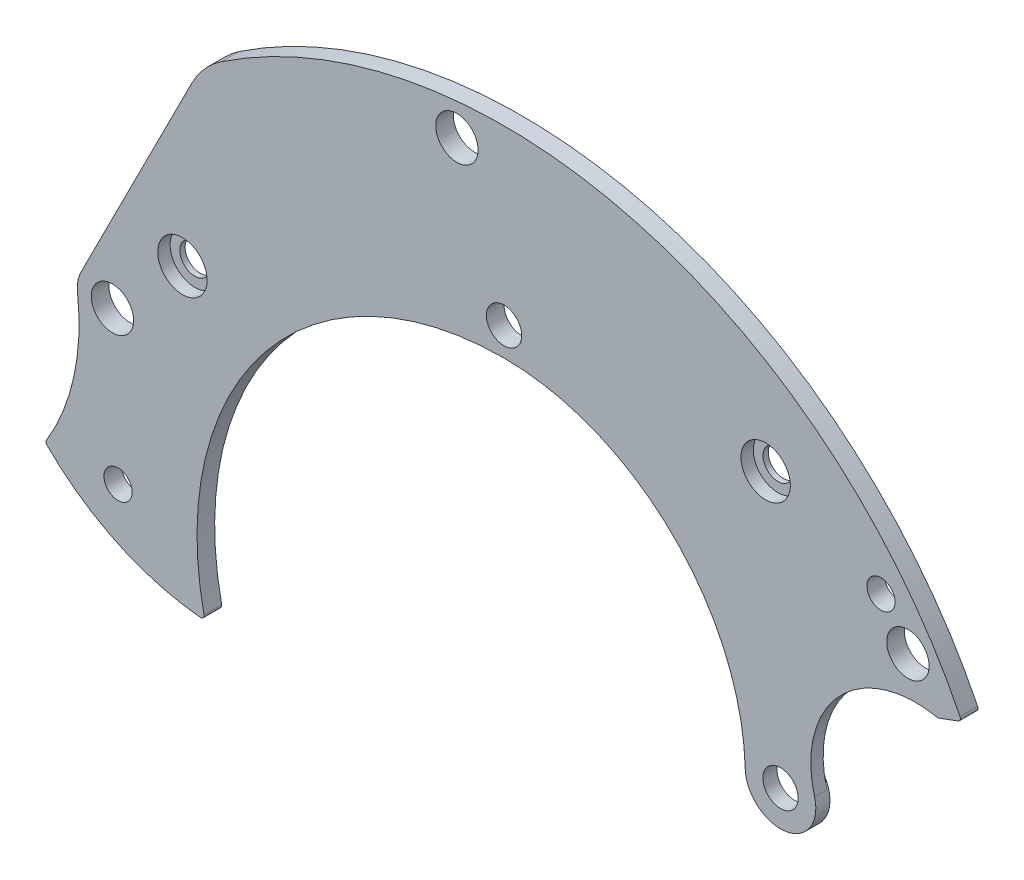
ISO-10303-21;
HEADER;
FILE_DESCRIPTION(('STEP AP214'),'2;1');
FILE_NAME('part.step','',(''),(''),'','','');
FILE_SCHEMA(('AUTOMOTIVE_DESIGN { 1 0 10303 214 1 1 1 1 }'));
ENDSEC;
DATA;
#1=APPLICATION_CONTEXT('core data for automotive mechanical design processes');
#2=APPLICATION_PROTOCOL_DEFINITION('international standard','automotive_design',2000,#1);
#3=PRODUCT_CONTEXT('',#1,'mechanical');
#4=PRODUCT('Part','Part','',(#3));
#5=PRODUCT_RELATED_PRODUCT_CATEGORY('part','',(#4));
#6=PRODUCT_DEFINITION_FORMATION('','',#4);
#7=PRODUCT_DEFINITION_CONTEXT('part definition',#1,'design');
#8=PRODUCT_DEFINITION('design','',#6,#7);
#9=PRODUCT_DEFINITION_SHAPE('','',#8);
#10=(LENGTH_UNIT() NAMED_UNIT(*) SI_UNIT(.MILLI.,.METRE.));
#11=(NAMED_UNIT(*) PLANE_ANGLE_UNIT() SI_UNIT($,.RADIAN.));
#12=(NAMED_UNIT(*) SI_UNIT($,.STERADIAN.) SOLID_ANGLE_UNIT());
#13=UNCERTAINTY_MEASURE_WITH_UNIT(LENGTH_MEASURE(1.E-05),#10,'distance_accuracy_value','');
#14=(GEOMETRIC_REPRESENTATION_CONTEXT(3) GLOBAL_UNCERTAINTY_ASSIGNED_CONTEXT((#13)) GLOBAL_UNIT_ASSIGNED_CONTEXT((#10,
#11,#12)) REPRESENTATION_CONTEXT('',''));
#15=CARTESIAN_POINT('',(0.,0.,0.));
#16=DIRECTION('',(0.,0.,1.));
#17=DIRECTION('',(1.,0.,0.));
#18=AXIS2_PLACEMENT_3D('',#15,#16,#17);
#19=CARTESIAN_POINT('',(7.83256247361286,2.06421052631571,0.1));
#20=DIRECTION('',(0.,0.,-1.));
#21=DIRECTION('',(-1.,0.,0.));
#22=AXIS2_PLACEMENT_3D('',#19,#20,#21);
#23=PLANE('',#22);
#24=CARTESIAN_POINT('',(7.83256247361286,2.06421052631571,0.1));
#25=DIRECTION('',(0.,0.,-1.));
#26=DIRECTION('',(-1.,0.,0.));
#27=AXIS2_PLACEMENT_3D('',#24,#25,#26);
#28=CIRCLE('',#27,0.500000000000003);
#29=CARTESIAN_POINT('',(7.33256247361286,2.06421052631571,0.1));
#30=VERTEX_POINT('',#29);
#31=EDGE_CURVE('E225',#30,#30,#28,.T.);
#32=ORIENTED_EDGE('',*,*,#31,.F.);
#33=EDGE_LOOP('',(#32));
#34=FACE_BOUND('',#33,.T.);
#35=CARTESIAN_POINT('',(7.83256247361286,2.06421052631571,0.1));
#36=DIRECTION('',(0.,0.,-1.));
#37=DIRECTION('',(-1.,0.,0.));
#38=AXIS2_PLACEMENT_3D('',#35,#36,#37);
#39=CIRCLE('',#38,1.00000000000004);
#40=CARTESIAN_POINT('',(6.83256247361282,2.06421052631571,0.1));
#41=VERTEX_POINT('',#40);
#42=EDGE_CURVE('E228',#41,#41,#39,.T.);
#43=ORIENTED_EDGE('',*,*,#42,.T.);
#44=EDGE_LOOP('',(#43));
#45=FACE_BOUND('',#44,.T.);
#46=ADVANCED_FACE('F41',(#34,#45),#23,.T.);
#47=CARTESIAN_POINT('',(-9.11249538832331,6.40140385749699,0.5));
#48=DIRECTION('',(0.,0.,-1.));
#49=DIRECTION('',(-1.,0.,0.));
#50=AXIS2_PLACEMENT_3D('',#47,#48,#49);
#51=CYLINDRICAL_SURFACE('',#50,0.425);
#52=CARTESIAN_POINT('',(-9.11249538832331,6.40140385749699,0.));
#53=DIRECTION('',(0.,0.,1.));
#54=DIRECTION('',(1.,0.,0.));
#55=AXIS2_PLACEMENT_3D('',#52,#53,#54);
#56=CIRCLE('',#55,0.425);
#57=CARTESIAN_POINT('',(-8.68749538832331,6.40140385749699,0.));
#58=VERTEX_POINT('',#57);
#59=EDGE_CURVE('E526',#58,#58,#56,.T.);
#60=ORIENTED_EDGE('',*,*,#59,.F.);
#61=EDGE_LOOP('',(#60));
#62=FACE_BOUND('',#61,.T.);
#63=CARTESIAN_POINT('',(-9.11249538832331,6.40140385749699,0.15));
#64=DIRECTION('',(0.,0.,1.));
#65=DIRECTION('',(1.,0.,0.));
#66=AXIS2_PLACEMENT_3D('',#63,#64,#65);
#67=CIRCLE('',#66,0.425);
#68=CARTESIAN_POINT('',(-8.68749538832331,6.40140385749699,0.15));
#69=VERTEX_POINT('',#68);
#70=EDGE_CURVE('E233',#69,#69,#67,.T.);
#71=ORIENTED_EDGE('',*,*,#70,.T.);
#72=EDGE_LOOP('',(#71));
#73=FACE_BOUND('',#72,.T.);
#74=ADVANCED_FACE('F309',(#62,#73),#51,.F.);
#75=CARTESIAN_POINT('',(7.41134336571488,9.62668999561585,0.5));
#76=DIRECTION('',(0.,0.,-1.));
#77=DIRECTION('',(-1.,0.,0.));
#78=AXIS2_PLACEMENT_3D('',#75,#76,#77);
#79=CYLINDRICAL_SURFACE('',#78,0.425);
#80=CARTESIAN_POINT('',(7.41134336571488,9.62668999561585,0.));
#81=DIRECTION('',(0.,0.,1.));
#82=DIRECTION('',(1.,0.,0.));
#83=AXIS2_PLACEMENT_3D('',#80,#81,#82);
#84=CIRCLE('',#83,0.425);
#85=CARTESIAN_POINT('',(7.83634336571488,9.62668999561585,0.));
#86=VERTEX_POINT('',#85);
#87=EDGE_CURVE('E517',#86,#86,#84,.T.);
#88=ORIENTED_EDGE('',*,*,#87,.F.);
#89=EDGE_LOOP('',(#88));
#90=FACE_BOUND('',#89,.T.);
#91=CARTESIAN_POINT('',(7.41134336571488,9.62668999561585,0.15));
#92=DIRECTION('',(0.,0.,1.));
#93=DIRECTION('',(1.,0.,0.));
#94=AXIS2_PLACEMENT_3D('',#91,#92,#93);
#95=CIRCLE('',#94,0.425);
#96=CARTESIAN_POINT('',(7.83634336571488,9.62668999561585,0.15));
#97=VERTEX_POINT('',#96);
#98=EDGE_CURVE('E230',#97,#97,#95,.T.);
#99=ORIENTED_EDGE('',*,*,#98,.T.);
#100=EDGE_LOOP('',(#99));
#101=FACE_BOUND('',#100,.T.);
#102=ADVANCED_FACE('F317',(#90,#101),#79,.F.);
#103=CARTESIAN_POINT('',(7.83256247361286,2.06421052631571,0.5));
#104=DIRECTION('',(0.,0.,-1.));
#105=DIRECTION('',(-1.,0.,0.));
#106=AXIS2_PLACEMENT_3D('',#103,#104,#105);
#107=CYLINDRICAL_SURFACE('',#106,1.00000000000004);
#108=ORIENTED_EDGE('',*,*,#42,.F.);
#109=EDGE_LOOP('',(#108));
#110=FACE_BOUND('',#109,.T.);
#111=CARTESIAN_POINT('',(7.83256247361286,2.06421052631571,0.15));
#112=DIRECTION('',(0.,0.,-1.));
#113=DIRECTION('',(-1.,0.,0.));
#114=AXIS2_PLACEMENT_3D('',#111,#112,#113);
#115=CIRCLE('',#114,0.999999999999933);
#116=CARTESIAN_POINT('',(6.83288606924126,2.03877263051951,0.15));
#117=VERTEX_POINT('',#116);
#118=CARTESIAN_POINT('',(8.79665468024266,2.32977825235851,0.15));
#119=VERTEX_POINT('',#118);
#120=EDGE_CURVE('E177',#117,#119,#115,.T.);
#121=ORIENTED_EDGE('',*,*,#120,.T.);
#122=DIRECTION('',(0.,0.,-1.));
#123=VECTOR('',#122,1.);
#124=CARTESIAN_POINT('',(8.79665468024252,2.32977825235861,0.5));
#125=LINE('',#124,#123);
#126=CARTESIAN_POINT('',(8.79665468024252,2.32977825235861,0.5));
#127=VERTEX_POINT('',#126);
#128=EDGE_CURVE('E193',#127,#119,#125,.T.);
#129=ORIENTED_EDGE('',*,*,#128,.F.);
#130=CARTESIAN_POINT('',(7.83256247361286,2.06421052631571,0.5));
#131=DIRECTION('',(0.,0.,1.));
#132=DIRECTION('',(1.,0.,0.));
#133=AXIS2_PLACEMENT_3D('',#130,#131,#132);
#134=CIRCLE('',#133,1.00000000000004);
#135=CARTESIAN_POINT('',(6.83288606924115,2.03877263051957,0.5));
#136=VERTEX_POINT('',#135);
#137=EDGE_CURVE('E434',#136,#127,#134,.T.);
#138=ORIENTED_EDGE('',*,*,#137,.F.);
#139=DIRECTION('',(0.,0.,-1.));
#140=VECTOR('',#139,1.);
#141=CARTESIAN_POINT('',(6.83288606924115,2.03877263051957,0.5));
#142=LINE('',#141,#140);
#143=EDGE_CURVE('E196',#136,#117,#142,.T.);
#144=ORIENTED_EDGE('',*,*,#143,.T.);
#145=EDGE_LOOP('',(#121,#129,#138,#144));
#146=FACE_BOUND('',#145,.T.);
#147=ADVANCED_FACE('F191',(#110,#146),#107,.T.);
#148=CARTESIAN_POINT('',(7.83256247361286,2.06421052631571,0.5));
#149=DIRECTION('',(0.,0.,-1.));
#150=DIRECTION('',(-1.,0.,0.));
#151=AXIS2_PLACEMENT_3D('',#148,#149,#150);
#152=CYLINDRICAL_SURFACE('',#151,0.500000000000003);
#153=CARTESIAN_POINT('',(7.83256247361286,2.06421052631571,0.5));
#154=DIRECTION('',(0.,0.,1.));
#155=DIRECTION('',(1.,0.,0.));
#156=AXIS2_PLACEMENT_3D('',#153,#154,#155);
#157=CIRCLE('',#156,0.500000000000003);
#158=CARTESIAN_POINT('',(8.33256247361286,2.06421052631571,0.5));
#159=VERTEX_POINT('',#158);
#160=EDGE_CURVE('E440',#159,#159,#157,.T.);
#161=ORIENTED_EDGE('',*,*,#160,.T.);
#162=EDGE_LOOP('',(#161));
#163=FACE_BOUND('',#162,.T.);
#164=ORIENTED_EDGE('',*,*,#31,.T.);
#165=EDGE_LOOP('',(#164));
#166=FACE_BOUND('',#165,.T.);
#167=ADVANCED_FACE('F346',(#163,#166),#152,.F.);
#168=CARTESIAN_POINT('',(0.,0.,0.5));
#169=DIRECTION('',(0.,0.,1.));
#170=DIRECTION('',(1.,0.,0.));
#171=AXIS2_PLACEMENT_3D('',#168,#169,#170);
#172=PLANE('',#171);
#173=CARTESIAN_POINT('',(-11.09555802988,4.37140059511632,0.5));
#174=DIRECTION('',(0.,0.,1.));
#175=DIRECTION('',(1.,0.,0.));
#176=AXIS2_PLACEMENT_3D('',#173,#174,#175);
#177=CIRCLE('',#176,0.6);
#178=CARTESIAN_POINT('',(-10.49555802988,4.37140059511632,0.5));
#179=VERTEX_POINT('',#178);
#180=EDGE_CURVE('E287',#179,#179,#177,.T.);
#181=ORIENTED_EDGE('',*,*,#180,.F.);
#182=EDGE_LOOP('',(#181));
#183=FACE_BOUND('',#182,.T.);
#184=CARTESIAN_POINT('',(11.4423077160047,7.16404872486644,0.5));
#185=DIRECTION('',(0.,0.,1.));
#186=DIRECTION('',(1.,0.,0.));
#187=AXIS2_PLACEMENT_3D('',#184,#185,#186);
#188=CIRCLE('',#187,0.6);
#189=CARTESIAN_POINT('',(12.0423077160047,7.16404872486644,0.5));
#190=VERTEX_POINT('',#189);
#191=EDGE_CURVE('E739',#190,#190,#188,.T.);
#192=ORIENTED_EDGE('',*,*,#191,.F.);
#193=EDGE_LOOP('',(#192));
#194=FACE_BOUND('',#193,.T.);
#195=CARTESIAN_POINT('',(-1.33624431537348,13.4337057854351,0.5));
#196=DIRECTION('',(0.,0.,1.));
#197=DIRECTION('',(1.,0.,0.));
#198=AXIS2_PLACEMENT_3D('',#195,#196,#197);
#199=CIRCLE('',#198,0.6);
#200=CARTESIAN_POINT('',(-0.736244315373481,13.4337057854351,0.5));
#201=VERTEX_POINT('',#200);
#202=EDGE_CURVE('E735',#201,#201,#199,.T.);
#203=ORIENTED_EDGE('',*,*,#202,.F.);
#204=EDGE_LOOP('',(#203));
#205=FACE_BOUND('',#204,.T.);
#206=CARTESIAN_POINT('',(-9.11249538832331,6.40140385749699,0.5));
#207=DIRECTION('',(0.,0.,1.));
#208=DIRECTION('',(1.,0.,0.));
#209=AXIS2_PLACEMENT_3D('',#206,#207,#208);
#210=CIRCLE('',#209,0.7);
#211=CARTESIAN_POINT('',(-8.41249538832331,6.40140385749699,0.5));
#212=VERTEX_POINT('',#211);
#213=EDGE_CURVE('E502',#212,#212,#210,.T.);
#214=ORIENTED_EDGE('',*,*,#213,.F.);
#215=EDGE_LOOP('',(#214));
#216=FACE_BOUND('',#215,.T.);
#217=CARTESIAN_POINT('',(7.41134336571488,9.62668999561585,0.5));
#218=DIRECTION('',(0.,0.,1.));
#219=DIRECTION('',(1.,0.,0.));
#220=AXIS2_PLACEMENT_3D('',#217,#218,#219);
#221=CIRCLE('',#220,0.699999999999999);
#222=CARTESIAN_POINT('',(8.11134336571488,9.62668999561585,0.5));
#223=VERTEX_POINT('',#222);
#224=EDGE_CURVE('E496',#223,#223,#221,.T.);
#225=ORIENTED_EDGE('',*,*,#224,.F.);
#226=EDGE_LOOP('',(#225));
#227=FACE_BOUND('',#226,.T.);
#228=ORIENTED_EDGE('',*,*,#160,.F.);
#229=EDGE_LOOP('',(#228));
#230=FACE_BOUND('',#229,.T.);
#231=DIRECTION('',(0.937994593753287,0.346649884017874,0.));
#232=VECTOR('',#231,1.);
#233=CARTESIAN_POINT('',(12.9661974683983,6.2640021719745,0.5));
#234=LINE('',#233,#232);
#235=CARTESIAN_POINT('',(12.3182081008108,6.02452804215015,0.5));
#236=VERTEX_POINT('',#235);
#237=CARTESIAN_POINT('',(12.8625276341486,6.22568943940852,0.5));
#238=VERTEX_POINT('',#237);
#239=EDGE_CURVE('E202',#236,#238,#234,.T.);
#240=ORIENTED_EDGE('',*,*,#239,.T.);
#241=CARTESIAN_POINT('',(12.8278626457469,6.31948889878385,0.5));
#242=DIRECTION('',(0.,0.,1.));
#243=DIRECTION('',(1.,0.,0.));
#244=AXIS2_PLACEMENT_3D('',#241,#242,#243);
#245=CIRCLE('',#244,0.1);
#246=CARTESIAN_POINT('',(12.9175679789339,6.36368112884528,0.5));
#247=VERTEX_POINT('',#246);
#248=EDGE_CURVE('E272',#238,#247,#245,.T.);
#249=ORIENTED_EDGE('',*,*,#248,.T.);
#250=CARTESIAN_POINT('',(0.,0.,0.5));
#251=DIRECTION('',(0.,0.,1.));
#252=DIRECTION('',(1.,0.,0.));
#253=AXIS2_PLACEMENT_3D('',#250,#251,#252);
#254=CIRCLE('',#253,14.4);
#255=CARTESIAN_POINT('',(-8.00929192283235,11.9670899927615,0.5));
#256=VERTEX_POINT('',#255);
#257=EDGE_CURVE('E460',#247,#256,#254,.T.);
#258=ORIENTED_EDGE('',*,*,#257,.T.);
#259=CARTESIAN_POINT('',(-6.61878985289618,9.88947020235152,0.5));
#260=DIRECTION('',(0.,0.,1.));
#261=DIRECTION('',(1.,0.,0.));
#262=AXIS2_PLACEMENT_3D('',#259,#260,#261);
#263=CIRCLE('',#262,2.5);
#264=CARTESIAN_POINT('',(-8.84952807425067,11.0181007830945,0.5));
#265=VERTEX_POINT('',#264);
#266=EDGE_CURVE('E463',#256,#265,#263,.T.);
#267=ORIENTED_EDGE('',*,*,#266,.T.);
#268=DIRECTION('',(-0.451452232297187,-0.892295288541796,0.));
#269=VECTOR('',#268,1.);
#270=CARTESIAN_POINT('',(-8.84952807425067,11.0181007830945,0.5));
#271=LINE('',#270,#269);
#272=CARTESIAN_POINT('',(-11.9847710538311,4.82129337142634,0.5));
#273=VERTEX_POINT('',#272);
#274=EDGE_CURVE('E467',#265,#273,#271,.T.);
#275=ORIENTED_EDGE('',*,*,#274,.T.);
#276=CARTESIAN_POINT('',(-11.09555802988,4.37140059511632,0.5));
#277=DIRECTION('',(0.,0.,1.));
#278=DIRECTION('',(1.,0.,0.));
#279=AXIS2_PLACEMENT_3D('',#276,#277,#278);
#280=CIRCLE('',#279,0.996545689941039);
#281=CARTESIAN_POINT('',(-12.085233501132,4.2545854687746,0.5));
#282=VERTEX_POINT('',#281);
#283=EDGE_CURVE('E429',#273,#282,#280,.T.);
#284=ORIENTED_EDGE('',*,*,#283,.T.);
#285=CARTESIAN_POINT('',(-18.4078332242241,3.50830519113288,0.5));
#286=DIRECTION('',(0.,0.,-1.));
#287=DIRECTION('',(1.,0.,0.));
#288=AXIS2_PLACEMENT_3D('',#285,#286,#287);
#289=CIRCLE('',#288,6.36649051764317);
#290=CARTESIAN_POINT('',(-12.9638685324626,0.207479545011136,0.5));
#291=VERTEX_POINT('',#290);
#292=EDGE_CURVE('E423',#282,#291,#289,.T.);
#293=ORIENTED_EDGE('',*,*,#292,.T.);
#294=CARTESIAN_POINT('',(-12.8783588678102,0.155632681547281,0.5));
#295=DIRECTION('',(0.,0.,1.));
#296=DIRECTION('',(1.,0.,0.));
#297=AXIS2_PLACEMENT_3D('',#294,#295,#296);
#298=CIRCLE('',#297,0.1);
#299=CARTESIAN_POINT('',(-12.9490352568796,0.0848877309987412,0.5));
#300=VERTEX_POINT('',#299);
#301=EDGE_CURVE('E268',#291,#300,#298,.T.);
#302=ORIENTED_EDGE('',*,*,#301,.T.);
#303=CARTESIAN_POINT('',(-7.90726359423526,5.13155029607002,0.5));
#304=DIRECTION('',(0.,0.,1.));
#305=DIRECTION('',(1.,0.,0.));
#306=AXIS2_PLACEMENT_3D('',#303,#304,#305);
#307=CIRCLE('',#306,7.133601092291);
#308=CARTESIAN_POINT('',(-8.60931390823198,-1.96742074912748,0.5));
#309=VERTEX_POINT('',#308);
#310=EDGE_CURVE('E421',#300,#309,#307,.T.);
#311=ORIENTED_EDGE('',*,*,#310,.T.);
#312=CARTESIAN_POINT('',(-8.59947245081218,-1.8679061988554,0.5));
#313=DIRECTION('',(0.,0.,1.));
#314=DIRECTION('',(1.,0.,0.));
#315=AXIS2_PLACEMENT_3D('',#312,#313,#314);
#316=CIRCLE('',#315,0.1);
#317=CARTESIAN_POINT('',(-8.50175117296204,-1.84667999205023,0.5));
#318=VERTEX_POINT('',#317);
#319=EDGE_CURVE('E58',#309,#318,#316,.T.);
#320=ORIENTED_EDGE('',*,*,#319,.T.);
#321=CARTESIAN_POINT('',(0.,0.,0.5));
#322=DIRECTION('',(0.,0.,-1.));
#323=DIRECTION('',(1.,0.,0.));
#324=AXIS2_PLACEMENT_3D('',#321,#322,#323);
#325=CIRCLE('',#324,8.7);
#326=CARTESIAN_POINT('',(0.,8.7,0.5));
#327=VERTEX_POINT('',#326);
#328=EDGE_CURVE('E425',#318,#327,#325,.T.);
#329=ORIENTED_EDGE('',*,*,#328,.T.);
#330=CARTESIAN_POINT('',(0.,1.86490212296664,0.5));
#331=DIRECTION('',(0.,0.,-1.));
#332=DIRECTION('',(-1.,0.,0.));
#333=AXIS2_PLACEMENT_3D('',#330,#331,#332);
#334=CIRCLE('',#333,6.83509787703336);
#335=EDGE_CURVE('E427',#327,#136,#334,.T.);
#336=ORIENTED_EDGE('',*,*,#335,.T.);
#337=ORIENTED_EDGE('',*,*,#137,.T.);
#338=CARTESIAN_POINT('',(11.6559920954219,3.11740803519091,0.5));
#339=DIRECTION('',(0.,0.,-1.));
#340=DIRECTION('',(1.,0.,0.));
#341=AXIS2_PLACEMENT_3D('',#338,#339,#340);
#342=CIRCLE('',#341,2.96583396849002);
#343=CARTESIAN_POINT('',(12.2630739342527,6.02044485369858,0.5));
#344=VERTEX_POINT('',#343);
#345=EDGE_CURVE('E201',#127,#344,#342,.T.);
#346=ORIENTED_EDGE('',*,*,#345,.T.);
#347=CARTESIAN_POINT('',(12.283543112409,6.11832750152548,0.5));
#348=DIRECTION('',(0.,0.,1.));
#349=DIRECTION('',(1.,0.,0.));
#350=AXIS2_PLACEMENT_3D('',#347,#348,#349);
#351=CIRCLE('',#350,0.1);
#352=EDGE_CURVE('E270',#344,#236,#351,.T.);
#353=ORIENTED_EDGE('',*,*,#352,.T.);
#354=EDGE_LOOP('',(#240,#249,#258,#267,#275,#284,#293,#302,#311,#320,#329,#336,#337,#346,#353));
#355=FACE_BOUND('',#354,.T.);
#356=CARTESIAN_POINT('',(0.,9.5,0.5));
#357=DIRECTION('',(0.,0.,1.));
#358=DIRECTION('',(1.,0.,0.));
#359=AXIS2_PLACEMENT_3D('',#356,#357,#358);
#360=CIRCLE('',#359,0.5);
#361=CARTESIAN_POINT('',(0.5,9.5,0.5));
#362=VERTEX_POINT('',#361);
#363=EDGE_CURVE('E532',#362,#362,#360,.T.);
#364=ORIENTED_EDGE('',*,*,#363,.F.);
#365=EDGE_LOOP('',(#364));
#366=FACE_BOUND('',#365,.T.);
#367=CARTESIAN_POINT('',(-10.9359284213145,0.135601583524778,0.5));
#368=DIRECTION('',(0.,0.,1.));
#369=DIRECTION('',(1.,0.,0.));
#370=AXIS2_PLACEMENT_3D('',#367,#368,#369);
#371=CIRCLE('',#370,0.4);
#372=CARTESIAN_POINT('',(-10.5359284213145,0.135601583524778,0.5));
#373=VERTEX_POINT('',#372);
#374=EDGE_CURVE('E523',#373,#373,#371,.T.);
#375=ORIENTED_EDGE('',*,*,#374,.F.);
#376=EDGE_LOOP('',(#375));
#377=FACE_BOUND('',#376,.T.);
#378=CARTESIAN_POINT('',(10.6792578509652,8.25101903907875,0.5));
#379=DIRECTION('',(0.,0.,1.));
#380=DIRECTION('',(1.,0.,0.));
#381=AXIS2_PLACEMENT_3D('',#378,#379,#380);
#382=CIRCLE('',#381,0.399999999999999);
#383=CARTESIAN_POINT('',(11.0792578509652,8.25101903907875,0.5));
#384=VERTEX_POINT('',#383);
#385=EDGE_CURVE('E514',#384,#384,#382,.T.);
#386=ORIENTED_EDGE('',*,*,#385,.F.);
#387=EDGE_LOOP('',(#386));
#388=FACE_BOUND('',#387,.T.);
#389=ADVANCED_FACE('F349',(#183,#194,#205,#216,#227,#230,#355,#366,#377,#388),#172,.T.);
#390=CARTESIAN_POINT('',(0.,0.,0.));
#391=DIRECTION('',(0.,0.,1.));
#392=DIRECTION('',(1.,0.,0.));
#393=AXIS2_PLACEMENT_3D('',#390,#391,#392);
#394=PLANE('',#393);
#395=CARTESIAN_POINT('',(-11.09555802988,4.37140059511632,0.));
#396=DIRECTION('',(0.,0.,1.));
#397=DIRECTION('',(1.,0.,0.));
#398=AXIS2_PLACEMENT_3D('',#395,#396,#397);
#399=CIRCLE('',#398,0.6);
#400=CARTESIAN_POINT('',(-10.49555802988,4.37140059511632,0.));
#401=VERTEX_POINT('',#400);
#402=EDGE_CURVE('E45',#401,#401,#399,.T.);
#403=ORIENTED_EDGE('',*,*,#402,.T.);
#404=EDGE_LOOP('',(#403));
#405=FACE_BOUND('',#404,.T.);
#406=CARTESIAN_POINT('',(11.4423077160047,7.16404872486644,0.));
#407=DIRECTION('',(0.,0.,1.));
#408=DIRECTION('',(1.,0.,0.));
#409=AXIS2_PLACEMENT_3D('',#406,#407,#408);
#410=CIRCLE('',#409,0.6);
#411=CARTESIAN_POINT('',(12.0423077160047,7.16404872486644,0.));
#412=VERTEX_POINT('',#411);
#413=EDGE_CURVE('E286',#412,#412,#410,.T.);
#414=ORIENTED_EDGE('',*,*,#413,.T.);
#415=EDGE_LOOP('',(#414));
#416=FACE_BOUND('',#415,.T.);
#417=CARTESIAN_POINT('',(-1.33624431537348,13.4337057854351,0.));
#418=DIRECTION('',(0.,0.,1.));
#419=DIRECTION('',(1.,0.,0.));
#420=AXIS2_PLACEMENT_3D('',#417,#418,#419);
#421=CIRCLE('',#420,0.6);
#422=CARTESIAN_POINT('',(-0.736244315373481,13.4337057854351,0.));
#423=VERTEX_POINT('',#422);
#424=EDGE_CURVE('E284',#423,#423,#421,.T.);
#425=ORIENTED_EDGE('',*,*,#424,.T.);
#426=EDGE_LOOP('',(#425));
#427=FACE_BOUND('',#426,.T.);
#428=CARTESIAN_POINT('',(7.83256247361286,2.06421052631571,0.));
#429=DIRECTION('',(0.,0.,-1.));
#430=DIRECTION('',(-1.,0.,0.));
#431=AXIS2_PLACEMENT_3D('',#428,#429,#430);
#432=CIRCLE('',#431,4.47202371480717);
#433=CARTESIAN_POINT('',(5.59875150260163,5.9383665184755,0.));
#434=VERTEX_POINT('',#433);
#435=CARTESIAN_POINT('',(10.2859225267318,5.80319709429878,0.));
#436=VERTEX_POINT('',#435);
#437=EDGE_CURVE('E229',#434,#436,#432,.T.);
#438=ORIENTED_EDGE('',*,*,#437,.F.);
#439=CARTESIAN_POINT('',(5.54880071715264,6.02499745424921,0.));
#440=DIRECTION('',(0.,0.,1.));
#441=DIRECTION('',(1.,0.,0.));
#442=AXIS2_PLACEMENT_3D('',#439,#440,#441);
#443=CIRCLE('',#442,0.1);
#444=CARTESIAN_POINT('',(5.46879030034903,5.96501134583307,0.));
#445=VERTEX_POINT('',#444);
#446=EDGE_CURVE('E253',#434,#445,#443,.F.);
#447=ORIENTED_EDGE('',*,*,#446,.T.);
#448=CARTESIAN_POINT('',(0.,1.86490212296664,0.));
#449=DIRECTION('',(0.,0.,-1.));
#450=DIRECTION('',(-1.,0.,0.));
#451=AXIS2_PLACEMENT_3D('',#448,#449,#450);
#452=CIRCLE('',#451,6.83509787703336);
#453=CARTESIAN_POINT('',(0.,8.7,0.));
#454=VERTEX_POINT('',#453);
#455=EDGE_CURVE('E453',#454,#445,#452,.T.);
#456=ORIENTED_EDGE('',*,*,#455,.F.);
#457=CARTESIAN_POINT('',(0.,0.,0.));
#458=DIRECTION('',(0.,0.,-1.));
#459=DIRECTION('',(1.,0.,0.));
#460=AXIS2_PLACEMENT_3D('',#457,#458,#459);
#461=CIRCLE('',#460,8.7);
#462=CARTESIAN_POINT('',(-8.50175117296204,-1.84667999205023,0.));
#463=VERTEX_POINT('',#462);
#464=EDGE_CURVE('E451',#463,#454,#461,.T.);
#465=ORIENTED_EDGE('',*,*,#464,.F.);
#466=CARTESIAN_POINT('',(-8.59947245081218,-1.8679061988554,0.));
#467=DIRECTION('',(0.,0.,1.));
#468=DIRECTION('',(1.,0.,0.));
#469=AXIS2_PLACEMENT_3D('',#466,#467,#468);
#470=CIRCLE('',#469,0.1);
#471=CARTESIAN_POINT('',(-8.60931390823198,-1.96742074912748,0.));
#472=VERTEX_POINT('',#471);
#473=EDGE_CURVE('E243',#463,#472,#470,.F.);
#474=ORIENTED_EDGE('',*,*,#473,.T.);
#475=CARTESIAN_POINT('',(-7.90726359423526,5.13155029607002,0.));
#476=DIRECTION('',(0.,0.,1.));
#477=DIRECTION('',(1.,0.,0.));
#478=AXIS2_PLACEMENT_3D('',#475,#476,#477);
#479=CIRCLE('',#478,7.133601092291);
#480=CARTESIAN_POINT('',(-12.9490352568796,0.0848877309987412,0.));
#481=VERTEX_POINT('',#480);
#482=EDGE_CURVE('E449',#481,#472,#479,.T.);
#483=ORIENTED_EDGE('',*,*,#482,.F.);
#484=CARTESIAN_POINT('',(-12.8783588678102,0.155632681547281,0.));
#485=DIRECTION('',(0.,0.,1.));
#486=DIRECTION('',(1.,0.,0.));
#487=AXIS2_PLACEMENT_3D('',#484,#485,#486);
#488=CIRCLE('',#487,0.1);
#489=CARTESIAN_POINT('',(-12.9638685324626,0.207479545011136,0.));
#490=VERTEX_POINT('',#489);
#491=EDGE_CURVE('E245',#481,#490,#488,.F.);
#492=ORIENTED_EDGE('',*,*,#491,.T.);
#493=CARTESIAN_POINT('',(-18.4078332242241,3.50830519113288,0.));
#494=DIRECTION('',(0.,0.,-1.));
#495=DIRECTION('',(1.,0.,0.));
#496=AXIS2_PLACEMENT_3D('',#493,#494,#495);
#497=CIRCLE('',#496,6.36649051764317);
#498=CARTESIAN_POINT('',(-12.085233501132,4.2545854687746,0.));
#499=VERTEX_POINT('',#498);
#500=EDGE_CURVE('E446',#499,#490,#497,.T.);
#501=ORIENTED_EDGE('',*,*,#500,.F.);
#502=CARTESIAN_POINT('',(-11.09555802988,4.37140059511632,0.));
#503=DIRECTION('',(0.,0.,1.));
#504=DIRECTION('',(1.,0.,0.));
#505=AXIS2_PLACEMENT_3D('',#502,#503,#504);
#506=CIRCLE('',#505,0.996545689941039);
#507=CARTESIAN_POINT('',(-11.9847710538311,4.82129337142634,0.));
#508=VERTEX_POINT('',#507);
#509=EDGE_CURVE('E444',#508,#499,#506,.T.);
#510=ORIENTED_EDGE('',*,*,#509,.F.);
#511=DIRECTION('',(-0.451452232297187,-0.892295288541796,0.));
#512=VECTOR('',#511,1.);
#513=CARTESIAN_POINT('',(-8.84952807425067,11.0181007830945,0.));
#514=LINE('',#513,#512);
#515=CARTESIAN_POINT('',(-8.84952807425067,11.0181007830945,0.));
#516=VERTEX_POINT('',#515);
#517=EDGE_CURVE('E442',#516,#508,#514,.T.);
#518=ORIENTED_EDGE('',*,*,#517,.F.);
#519=CARTESIAN_POINT('',(-6.61878985289618,9.88947020235152,0.));
#520=DIRECTION('',(0.,0.,1.));
#521=DIRECTION('',(1.,0.,0.));
#522=AXIS2_PLACEMENT_3D('',#519,#520,#521);
#523=CIRCLE('',#522,2.5);
#524=CARTESIAN_POINT('',(-8.00929192283235,11.9670899927615,0.));
#525=VERTEX_POINT('',#524);
#526=EDGE_CURVE('E439',#525,#516,#523,.T.);
#527=ORIENTED_EDGE('',*,*,#526,.F.);
#528=CARTESIAN_POINT('',(0.,0.,0.));
#529=DIRECTION('',(0.,0.,1.));
#530=DIRECTION('',(1.,0.,0.));
#531=AXIS2_PLACEMENT_3D('',#528,#529,#530);
#532=CIRCLE('',#531,14.4);
#533=CARTESIAN_POINT('',(12.9175679789339,6.36368112884528,0.));
#534=VERTEX_POINT('',#533);
#535=EDGE_CURVE('E437',#534,#525,#532,.T.);
#536=ORIENTED_EDGE('',*,*,#535,.F.);
#537=CARTESIAN_POINT('',(12.8278626457469,6.31948889878385,0.));
#538=DIRECTION('',(0.,0.,1.));
#539=DIRECTION('',(1.,0.,0.));
#540=AXIS2_PLACEMENT_3D('',#537,#538,#539);
#541=CIRCLE('',#540,0.1);
#542=CARTESIAN_POINT('',(12.8625276341486,6.22568943940852,0.));
#543=VERTEX_POINT('',#542);
#544=EDGE_CURVE('E249',#534,#543,#541,.F.);
#545=ORIENTED_EDGE('',*,*,#544,.T.);
#546=DIRECTION('',(0.937994593753287,0.346649884017874,0.));
#547=VECTOR('',#546,1.);
#548=CARTESIAN_POINT('',(12.9661974683983,6.2640021719745,0.));
#549=LINE('',#548,#547);
#550=CARTESIAN_POINT('',(12.3182081008108,6.02452804215015,0.));
#551=VERTEX_POINT('',#550);
#552=EDGE_CURVE('E209',#551,#543,#549,.T.);
#553=ORIENTED_EDGE('',*,*,#552,.F.);
#554=CARTESIAN_POINT('',(12.283543112409,6.11832750152548,0.));
#555=DIRECTION('',(0.,0.,1.));
#556=DIRECTION('',(1.,0.,0.));
#557=AXIS2_PLACEMENT_3D('',#554,#555,#556);
#558=CIRCLE('',#557,0.1);
#559=CARTESIAN_POINT('',(12.2630739342527,6.02044485369858,0.));
#560=VERTEX_POINT('',#559);
#561=EDGE_CURVE('E247',#551,#560,#558,.F.);
#562=ORIENTED_EDGE('',*,*,#561,.T.);
#563=CARTESIAN_POINT('',(11.6559920954219,3.11740803519091,0.));
#564=DIRECTION('',(0.,0.,-1.));
#565=DIRECTION('',(1.,0.,0.));
#566=AXIS2_PLACEMENT_3D('',#563,#564,#565);
#567=CIRCLE('',#566,2.96583396849002);
#568=CARTESIAN_POINT('',(10.383681613368,5.7964745080327,0.));
#569=VERTEX_POINT('',#568);
#570=EDGE_CURVE('E455',#569,#560,#567,.T.);
#571=ORIENTED_EDGE('',*,*,#570,.F.);
#572=CARTESIAN_POINT('',(10.340782702115,5.88680547400399,0.));
#573=DIRECTION('',(0.,0.,1.));
#574=DIRECTION('',(1.,0.,0.));
#575=AXIS2_PLACEMENT_3D('',#572,#573,#574);
#576=CIRCLE('',#575,0.1);
#577=EDGE_CURVE('E251',#569,#436,#576,.F.);
#578=ORIENTED_EDGE('',*,*,#577,.T.);
#579=EDGE_LOOP('',(#438,#447,#456,#465,#474,#483,#492,#501,#510,#518,#527,#536,#545,#553,#562,
#571,#578));
#580=FACE_BOUND('',#579,.T.);
#581=CARTESIAN_POINT('',(0.,9.5,0.));
#582=DIRECTION('',(0.,0.,1.));
#583=DIRECTION('',(1.,0.,0.));
#584=AXIS2_PLACEMENT_3D('',#581,#582,#583);
#585=CIRCLE('',#584,0.5);
#586=CARTESIAN_POINT('',(0.5,9.5,0.));
#587=VERTEX_POINT('',#586);
#588=EDGE_CURVE('E531',#587,#587,#585,.T.);
#589=ORIENTED_EDGE('',*,*,#588,.T.);
#590=EDGE_LOOP('',(#589));
#591=FACE_BOUND('',#590,.T.);
#592=ORIENTED_EDGE('',*,*,#59,.T.);
#593=EDGE_LOOP('',(#592));
#594=FACE_BOUND('',#593,.T.);
#595=CARTESIAN_POINT('',(-10.9359284213145,0.135601583524778,0.));
#596=DIRECTION('',(0.,0.,1.));
#597=DIRECTION('',(1.,0.,0.));
#598=AXIS2_PLACEMENT_3D('',#595,#596,#597);
#599=CIRCLE('',#598,0.4);
#600=CARTESIAN_POINT('',(-10.5359284213145,0.135601583524778,0.));
#601=VERTEX_POINT('',#600);
#602=EDGE_CURVE('E522',#601,#601,#599,.T.);
#603=ORIENTED_EDGE('',*,*,#602,.T.);
#604=EDGE_LOOP('',(#603));
#605=FACE_BOUND('',#604,.T.);
#606=ORIENTED_EDGE('',*,*,#87,.T.);
#607=EDGE_LOOP('',(#606));
#608=FACE_BOUND('',#607,.T.);
#609=CARTESIAN_POINT('',(10.6792578509652,8.25101903907875,0.));
#610=DIRECTION('',(0.,0.,1.));
#611=DIRECTION('',(1.,0.,0.));
#612=AXIS2_PLACEMENT_3D('',#609,#610,#611);
#613=CIRCLE('',#612,0.399999999999999);
#614=CARTESIAN_POINT('',(11.0792578509652,8.25101903907875,0.));
#615=VERTEX_POINT('',#614);
#616=EDGE_CURVE('E513',#615,#615,#613,.T.);
#617=ORIENTED_EDGE('',*,*,#616,.T.);
#618=EDGE_LOOP('',(#617));
#619=FACE_BOUND('',#618,.T.);
#620=ADVANCED_FACE('F294',(#405,#416,#427,#580,#591,#594,#605,#608,#619),#394,.F.);
#621=CARTESIAN_POINT('',(0.,0.,0.5));
#622=DIRECTION('',(0.,0.,-1.));
#623=DIRECTION('',(-1.,0.,0.));
#624=AXIS2_PLACEMENT_3D('',#621,#622,#623);
#625=CYLINDRICAL_SURFACE('',#624,14.4);
#626=ORIENTED_EDGE('',*,*,#257,.F.);
#627=DIRECTION('',(0.,0.,-1.));
#628=VECTOR('',#627,1.);
#629=CARTESIAN_POINT('',(12.9175679789339,6.36368112884528,0.5));
#630=LINE('',#629,#628);
#631=EDGE_CURVE('E259',#247,#534,#630,.T.);
#632=ORIENTED_EDGE('',*,*,#631,.T.);
#633=ORIENTED_EDGE('',*,*,#535,.T.);
#634=DIRECTION('',(0.,0.,-1.));
#635=VECTOR('',#634,1.);
#636=CARTESIAN_POINT('',(-8.00929192283235,11.9670899927615,0.5));
#637=LINE('',#636,#635);
#638=EDGE_CURVE('E186',#256,#525,#637,.T.);
#639=ORIENTED_EDGE('',*,*,#638,.F.);
#640=EDGE_LOOP('',(#626,#632,#633,#639));
#641=FACE_BOUND('',#640,.T.);
#642=ADVANCED_FACE('F356',(#641),#625,.T.);
#643=CARTESIAN_POINT('',(-6.61878985289618,9.88947020235152,0.5));
#644=DIRECTION('',(0.,0.,-1.));
#645=DIRECTION('',(-1.,0.,0.));
#646=AXIS2_PLACEMENT_3D('',#643,#644,#645);
#647=CYLINDRICAL_SURFACE('',#646,2.5);
#648=ORIENTED_EDGE('',*,*,#526,.T.);
#649=DIRECTION('',(0.,0.,-1.));
#650=VECTOR('',#649,1.);
#651=CARTESIAN_POINT('',(-8.84952807425067,11.0181007830945,0.5));
#652=LINE('',#651,#650);
#653=EDGE_CURVE('E220',#265,#516,#652,.T.);
#654=ORIENTED_EDGE('',*,*,#653,.F.);
#655=ORIENTED_EDGE('',*,*,#266,.F.);
#656=ORIENTED_EDGE('',*,*,#638,.T.);
#657=EDGE_LOOP('',(#648,#654,#655,#656));
#658=FACE_BOUND('',#657,.T.);
#659=ADVANCED_FACE('F386',(#658),#647,.T.);
#660=CARTESIAN_POINT('',(-8.84952807425067,11.0181007830945,0.5));
#661=DIRECTION('',(0.892295288541796,-0.451452232297187,0.));
#662=DIRECTION('',(0.451452232297187,0.892295288541796,0.));
#663=AXIS2_PLACEMENT_3D('',#660,#661,#662);
#664=PLANE('',#663);
#665=ORIENTED_EDGE('',*,*,#517,.T.);
#666=DIRECTION('',(0.,0.,-1.));
#667=VECTOR('',#666,1.);
#668=CARTESIAN_POINT('',(-11.9847710538311,4.82129337142634,0.5));
#669=LINE('',#668,#667);
#670=EDGE_CURVE('E217',#273,#508,#669,.T.);
#671=ORIENTED_EDGE('',*,*,#670,.F.);
#672=ORIENTED_EDGE('',*,*,#274,.F.);
#673=ORIENTED_EDGE('',*,*,#653,.T.);
#674=EDGE_LOOP('',(#665,#671,#672,#673));
#675=FACE_BOUND('',#674,.T.);
#676=ADVANCED_FACE('F382',(#675),#664,.F.);
#677=CARTESIAN_POINT('',(-11.09555802988,4.37140059511632,0.5));
#678=DIRECTION('',(0.,0.,-1.));
#679=DIRECTION('',(-1.,0.,0.));
#680=AXIS2_PLACEMENT_3D('',#677,#678,#679);
#681=CYLINDRICAL_SURFACE('',#680,0.996545689941039);
#682=ORIENTED_EDGE('',*,*,#509,.T.);
#683=DIRECTION('',(0.,0.,-1.));
#684=VECTOR('',#683,1.);
#685=CARTESIAN_POINT('',(-12.085233501132,4.2545854687746,0.5));
#686=LINE('',#685,#684);
#687=EDGE_CURVE('E214',#282,#499,#686,.T.);
#688=ORIENTED_EDGE('',*,*,#687,.F.);
#689=ORIENTED_EDGE('',*,*,#283,.F.);
#690=ORIENTED_EDGE('',*,*,#670,.T.);
#691=EDGE_LOOP('',(#682,#688,#689,#690));
#692=FACE_BOUND('',#691,.T.);
#693=ADVANCED_FACE('F378',(#692),#681,.T.);
#694=CARTESIAN_POINT('',(-18.4078332242241,3.50830519113288,0.5));
#695=DIRECTION('',(0.,0.,-1.));
#696=DIRECTION('',(-1.,0.,0.));
#697=AXIS2_PLACEMENT_3D('',#694,#695,#696);
#698=CYLINDRICAL_SURFACE('',#697,6.36649051764317);
#699=ORIENTED_EDGE('',*,*,#500,.T.);
#700=DIRECTION('',(0.,0.,-1.));
#701=VECTOR('',#700,1.);
#702=CARTESIAN_POINT('',(-12.9638685324626,0.207479545011136,0.5));
#703=LINE('',#702,#701);
#704=EDGE_CURVE('E278',#490,#291,#703,.F.);
#705=ORIENTED_EDGE('',*,*,#704,.T.);
#706=ORIENTED_EDGE('',*,*,#292,.F.);
#707=ORIENTED_EDGE('',*,*,#687,.T.);
#708=EDGE_LOOP('',(#699,#705,#706,#707));
#709=FACE_BOUND('',#708,.T.);
#710=ADVANCED_FACE('F375',(#709),#698,.F.);
#711=CARTESIAN_POINT('',(-7.90726359423526,5.13155029607002,0.5));
#712=DIRECTION('',(0.,0.,-1.));
#713=DIRECTION('',(-1.,0.,0.));
#714=AXIS2_PLACEMENT_3D('',#711,#712,#713);
#715=CYLINDRICAL_SURFACE('',#714,7.133601092291);
#716=ORIENTED_EDGE('',*,*,#310,.F.);
#717=DIRECTION('',(0.,0.,-1.));
#718=VECTOR('',#717,1.);
#719=CARTESIAN_POINT('',(-12.9490352568796,0.0848877309987412,0.5));
#720=LINE('',#719,#718);
#721=EDGE_CURVE('E275',#300,#481,#720,.T.);
#722=ORIENTED_EDGE('',*,*,#721,.T.);
#723=ORIENTED_EDGE('',*,*,#482,.T.);
#724=DIRECTION('',(0.,0.,-1.));
#725=VECTOR('',#724,1.);
#726=CARTESIAN_POINT('',(-8.60931390823198,-1.96742074912748,0.5));
#727=LINE('',#726,#725);
#728=EDGE_CURVE('E66',#472,#309,#727,.F.);
#729=ORIENTED_EDGE('',*,*,#728,.T.);
#730=EDGE_LOOP('',(#716,#722,#723,#729));
#731=FACE_BOUND('',#730,.T.);
#732=ADVANCED_FACE('F371',(#731),#715,.T.);
#733=CARTESIAN_POINT('',(0.,0.,0.5));
#734=DIRECTION('',(0.,0.,-1.));
#735=DIRECTION('',(-1.,0.,0.));
#736=AXIS2_PLACEMENT_3D('',#733,#734,#735);
#737=CYLINDRICAL_SURFACE('',#736,8.7);
#738=ORIENTED_EDGE('',*,*,#328,.F.);
#739=DIRECTION('',(0.,0.,-1.));
#740=VECTOR('',#739,1.);
#741=CARTESIAN_POINT('',(-8.50175117296204,-1.84667999205023,0.5));
#742=LINE('',#741,#740);
#743=EDGE_CURVE('E280',#318,#463,#742,.T.);
#744=ORIENTED_EDGE('',*,*,#743,.T.);
#745=ORIENTED_EDGE('',*,*,#464,.T.);
#746=DIRECTION('',(0.,0.,-1.));
#747=VECTOR('',#746,1.);
#748=CARTESIAN_POINT('',(0.,8.7,0.5));
#749=LINE('',#748,#747);
#750=EDGE_CURVE('E204',#327,#454,#749,.T.);
#751=ORIENTED_EDGE('',*,*,#750,.F.);
#752=EDGE_LOOP('',(#738,#744,#745,#751));
#753=FACE_BOUND('',#752,.T.);
#754=ADVANCED_FACE('F367',(#753),#737,.F.);
#755=CARTESIAN_POINT('',(0.,1.86490212296664,0.5));
#756=DIRECTION('',(0.,0.,-1.));
#757=DIRECTION('',(-1.,0.,0.));
#758=AXIS2_PLACEMENT_3D('',#755,#756,#757);
#759=CYLINDRICAL_SURFACE('',#758,6.83509787703336);
#760=ORIENTED_EDGE('',*,*,#455,.T.);
#761=DIRECTION('',(0.,0.,-1.));
#762=VECTOR('',#761,1.);
#763=CARTESIAN_POINT('',(5.46879030034903,5.96501134583307,0.5));
#764=LINE('',#763,#762);
#765=CARTESIAN_POINT('',(5.46879030034903,5.96501134583307,0.15));
#766=VERTEX_POINT('',#765);
#767=EDGE_CURVE('E185',#445,#766,#764,.F.);
#768=ORIENTED_EDGE('',*,*,#767,.T.);
#769=CARTESIAN_POINT('',(0.,1.86490212296664,0.15));
#770=DIRECTION('',(0.,0.,-1.));
#771=DIRECTION('',(-1.,0.,0.));
#772=AXIS2_PLACEMENT_3D('',#769,#770,#771);
#773=CIRCLE('',#772,6.83509787703336);
#774=EDGE_CURVE('E492',#117,#766,#773,.F.);
#775=ORIENTED_EDGE('',*,*,#774,.F.);
#776=ORIENTED_EDGE('',*,*,#143,.F.);
#777=ORIENTED_EDGE('',*,*,#335,.F.);
#778=ORIENTED_EDGE('',*,*,#750,.T.);
#779=EDGE_LOOP('',(#760,#768,#775,#776,#777,#778));
#780=FACE_BOUND('',#779,.T.);
#781=ADVANCED_FACE('F362',(#780),#759,.F.);
#782=CARTESIAN_POINT('',(11.6559920954219,3.11740803519091,0.5));
#783=DIRECTION('',(0.,0.,-1.));
#784=DIRECTION('',(-1.,0.,0.));
#785=AXIS2_PLACEMENT_3D('',#782,#783,#784);
#786=CYLINDRICAL_SURFACE('',#785,2.96583396849002);
#787=CARTESIAN_POINT('',(11.6559920954219,3.11740803519091,0.15));
#788=DIRECTION('',(0.,0.,-1.));
#789=DIRECTION('',(-1.,0.,0.));
#790=AXIS2_PLACEMENT_3D('',#787,#788,#789);
#791=CIRCLE('',#790,2.96583396849002);
#792=CARTESIAN_POINT('',(10.383681613368,5.7964745080327,0.15));
#793=VERTEX_POINT('',#792);
#794=EDGE_CURVE('E174',#793,#119,#791,.F.);
#795=ORIENTED_EDGE('',*,*,#794,.F.);
#796=DIRECTION('',(0.,0.,-1.));
#797=VECTOR('',#796,1.);
#798=CARTESIAN_POINT('',(10.383681613368,5.7964745080327,0.5));
#799=LINE('',#798,#797);
#800=EDGE_CURVE('E257',#793,#569,#799,.T.);
#801=ORIENTED_EDGE('',*,*,#800,.T.);
#802=ORIENTED_EDGE('',*,*,#570,.T.);
#803=DIRECTION('',(0.,0.,-1.));
#804=VECTOR('',#803,1.);
#805=CARTESIAN_POINT('',(12.2630739342527,6.02044485369858,0.5));
#806=LINE('',#805,#804);
#807=EDGE_CURVE('E255',#560,#344,#806,.F.);
#808=ORIENTED_EDGE('',*,*,#807,.T.);
#809=ORIENTED_EDGE('',*,*,#345,.F.);
#810=ORIENTED_EDGE('',*,*,#128,.T.);
#811=EDGE_LOOP('',(#795,#801,#802,#808,#809,#810));
#812=FACE_BOUND('',#811,.T.);
#813=ADVANCED_FACE('F199',(#812),#786,.F.);
#814=CARTESIAN_POINT('',(12.9661974683983,6.2640021719745,0.5));
#815=DIRECTION('',(-0.346649884017874,0.937994593753287,0.));
#816=DIRECTION('',(-0.937994593753288,-0.346649884017874,0.));
#817=AXIS2_PLACEMENT_3D('',#814,#815,#816);
#818=PLANE('',#817);
#819=ORIENTED_EDGE('',*,*,#552,.T.);
#820=DIRECTION('',(0.,0.,-1.));
#821=VECTOR('',#820,1.);
#822=CARTESIAN_POINT('',(12.8625276341486,6.22568943940852,0.5));
#823=LINE('',#822,#821);
#824=EDGE_CURVE('E265',#543,#238,#823,.F.);
#825=ORIENTED_EDGE('',*,*,#824,.T.);
#826=ORIENTED_EDGE('',*,*,#239,.F.);
#827=DIRECTION('',(0.,0.,-1.));
#828=VECTOR('',#827,1.);
#829=CARTESIAN_POINT('',(12.3182081008108,6.02452804215015,0.5));
#830=LINE('',#829,#828);
#831=EDGE_CURVE('E262',#236,#551,#830,.T.);
#832=ORIENTED_EDGE('',*,*,#831,.T.);
#833=EDGE_LOOP('',(#819,#825,#826,#832));
#834=FACE_BOUND('',#833,.T.);
#835=ADVANCED_FACE('F344',(#834),#818,.F.);
#836=CARTESIAN_POINT('',(0.,9.5,0.5));
#837=DIRECTION('',(0.,0.,-1.));
#838=DIRECTION('',(-1.,0.,0.));
#839=AXIS2_PLACEMENT_3D('',#836,#837,#838);
#840=CYLINDRICAL_SURFACE('',#839,0.5);
#841=ORIENTED_EDGE('',*,*,#363,.T.);
#842=EDGE_LOOP('',(#841));
#843=FACE_BOUND('',#842,.T.);
#844=ORIENTED_EDGE('',*,*,#588,.F.);
#845=EDGE_LOOP('',(#844));
#846=FACE_BOUND('',#845,.T.);
#847=ADVANCED_FACE('F339',(#843,#846),#840,.F.);
#848=CARTESIAN_POINT('',(-10.9359284213145,0.135601583524778,0.5));
#849=DIRECTION('',(0.,0.,-1.));
#850=DIRECTION('',(-1.,0.,0.));
#851=AXIS2_PLACEMENT_3D('',#848,#849,#850);
#852=CYLINDRICAL_SURFACE('',#851,0.4);
#853=ORIENTED_EDGE('',*,*,#374,.T.);
#854=EDGE_LOOP('',(#853));
#855=FACE_BOUND('',#854,.T.);
#856=ORIENTED_EDGE('',*,*,#602,.F.);
#857=EDGE_LOOP('',(#856));
#858=FACE_BOUND('',#857,.T.);
#859=ADVANCED_FACE('F333',(#855,#858),#852,.F.);
#860=CARTESIAN_POINT('',(10.6792578509652,8.25101903907875,0.5));
#861=DIRECTION('',(0.,0.,-1.));
#862=DIRECTION('',(-1.,0.,0.));
#863=AXIS2_PLACEMENT_3D('',#860,#861,#862);
#864=CYLINDRICAL_SURFACE('',#863,0.399999999999999);
#865=ORIENTED_EDGE('',*,*,#385,.T.);
#866=EDGE_LOOP('',(#865));
#867=FACE_BOUND('',#866,.T.);
#868=ORIENTED_EDGE('',*,*,#616,.F.);
#869=EDGE_LOOP('',(#868));
#870=FACE_BOUND('',#869,.T.);
#871=ADVANCED_FACE('F329',(#867,#870),#864,.F.);
#872=CARTESIAN_POINT('',(7.83256247361286,2.06421052631571,0.1));
#873=DIRECTION('',(0.,0.,-1.));
#874=DIRECTION('',(-1.,0.,0.));
#875=AXIS2_PLACEMENT_3D('',#872,#873,#874);
#876=CYLINDRICAL_SURFACE('',#875,4.47202371480717);
#877=CARTESIAN_POINT('',(7.83256247361286,2.06421052631571,0.15));
#878=DIRECTION('',(0.,0.,-1.));
#879=DIRECTION('',(-1.,0.,0.));
#880=AXIS2_PLACEMENT_3D('',#877,#878,#879);
#881=CIRCLE('',#880,4.47202371480717);
#882=CARTESIAN_POINT('',(5.59875150260163,5.9383665184755,0.15));
#883=VERTEX_POINT('',#882);
#884=CARTESIAN_POINT('',(10.2859225267318,5.80319709429878,0.15));
#885=VERTEX_POINT('',#884);
#886=EDGE_CURVE('E197',#883,#885,#881,.T.);
#887=ORIENTED_EDGE('',*,*,#886,.F.);
#888=DIRECTION('',(0.,0.,-1.));
#889=VECTOR('',#888,1.);
#890=CARTESIAN_POINT('',(5.59875150260163,5.9383665184755,0.1));
#891=LINE('',#890,#889);
#892=EDGE_CURVE('E241',#883,#434,#891,.T.);
#893=ORIENTED_EDGE('',*,*,#892,.T.);
#894=ORIENTED_EDGE('',*,*,#437,.T.);
#895=DIRECTION('',(0.,0.,-1.));
#896=VECTOR('',#895,1.);
#897=CARTESIAN_POINT('',(10.2859225267318,5.80319709429878,0.1));
#898=LINE('',#897,#896);
#899=EDGE_CURVE('E239',#436,#885,#898,.F.);
#900=ORIENTED_EDGE('',*,*,#899,.T.);
#901=EDGE_LOOP('',(#887,#893,#894,#900));
#902=FACE_BOUND('',#901,.T.);
#903=ADVANCED_FACE('F326',(#902),#876,.F.);
#904=CARTESIAN_POINT('',(7.41134336571488,9.62668999561585,0.15));
#905=DIRECTION('',(0.,0.,1.));
#906=DIRECTION('',(1.,0.,0.));
#907=AXIS2_PLACEMENT_3D('',#904,#905,#906);
#908=CYLINDRICAL_SURFACE('',#907,0.699999999999999);
#909=CARTESIAN_POINT('',(7.41134336571488,9.62668999561585,0.15));
#910=DIRECTION('',(0.,0.,1.));
#911=DIRECTION('',(1.,0.,0.));
#912=AXIS2_PLACEMENT_3D('',#909,#910,#911);
#913=CIRCLE('',#912,0.699999999999999);
#914=CARTESIAN_POINT('',(8.11134336571488,9.62668999561585,0.15));
#915=VERTEX_POINT('',#914);
#916=EDGE_CURVE('E505',#915,#915,#913,.T.);
#917=ORIENTED_EDGE('',*,*,#916,.F.);
#918=EDGE_LOOP('',(#917));
#919=FACE_BOUND('',#918,.T.);
#920=ORIENTED_EDGE('',*,*,#224,.T.);
#921=EDGE_LOOP('',(#920));
#922=FACE_BOUND('',#921,.T.);
#923=ADVANCED_FACE('F324',(#919,#922),#908,.F.);
#924=CARTESIAN_POINT('',(7.41134336571488,9.62668999561585,0.15));
#925=DIRECTION('',(0.,0.,1.));
#926=DIRECTION('',(1.,0.,0.));
#927=AXIS2_PLACEMENT_3D('',#924,#925,#926);
#928=PLANE('',#927);
#929=ORIENTED_EDGE('',*,*,#98,.F.);
#930=EDGE_LOOP('',(#929));
#931=FACE_BOUND('',#930,.T.);
#932=ORIENTED_EDGE('',*,*,#916,.T.);
#933=EDGE_LOOP('',(#932));
#934=FACE_BOUND('',#933,.T.);
#935=ADVANCED_FACE('F549',(#931,#934),#928,.T.);
#936=CARTESIAN_POINT('',(-9.11249538832331,6.40140385749699,0.15));
#937=DIRECTION('',(0.,0.,1.));
#938=DIRECTION('',(1.,0.,0.));
#939=AXIS2_PLACEMENT_3D('',#936,#937,#938);
#940=CYLINDRICAL_SURFACE('',#939,0.7);
#941=CARTESIAN_POINT('',(-9.11249538832331,6.40140385749699,0.15));
#942=DIRECTION('',(0.,0.,1.));
#943=DIRECTION('',(1.,0.,0.));
#944=AXIS2_PLACEMENT_3D('',#941,#942,#943);
#945=CIRCLE('',#944,0.7);
#946=CARTESIAN_POINT('',(-8.41249538832331,6.40140385749699,0.15));
#947=VERTEX_POINT('',#946);
#948=EDGE_CURVE('E234',#947,#947,#945,.T.);
#949=ORIENTED_EDGE('',*,*,#948,.F.);
#950=EDGE_LOOP('',(#949));
#951=FACE_BOUND('',#950,.T.);
#952=ORIENTED_EDGE('',*,*,#213,.T.);
#953=EDGE_LOOP('',(#952));
#954=FACE_BOUND('',#953,.T.);
#955=ADVANCED_FACE('F552',(#951,#954),#940,.F.);
#956=CARTESIAN_POINT('',(-9.11249538832331,6.40140385749699,0.15));
#957=DIRECTION('',(0.,0.,1.));
#958=DIRECTION('',(1.,0.,0.));
#959=AXIS2_PLACEMENT_3D('',#956,#957,#958);
#960=PLANE('',#959);
#961=ORIENTED_EDGE('',*,*,#70,.F.);
#962=EDGE_LOOP('',(#961));
#963=FACE_BOUND('',#962,.T.);
#964=ORIENTED_EDGE('',*,*,#948,.T.);
#965=EDGE_LOOP('',(#964));
#966=FACE_BOUND('',#965,.T.);
#967=ADVANCED_FACE('F577',(#963,#966),#960,.T.);
#968=CARTESIAN_POINT('',(7.83256247361286,2.06421052631571,0.15));
#969=DIRECTION('',(0.,0.,-1.));
#970=DIRECTION('',(-1.,0.,0.));
#971=AXIS2_PLACEMENT_3D('',#968,#969,#970);
#972=PLANE('',#971);
#973=ORIENTED_EDGE('',*,*,#774,.T.);
#974=CARTESIAN_POINT('',(5.54880071715264,6.02499745424921,0.15));
#975=DIRECTION('',(0.,0.,-1.));
#976=DIRECTION('',(-1.,0.,0.));
#977=AXIS2_PLACEMENT_3D('',#974,#975,#976);
#978=CIRCLE('',#977,0.1);
#979=EDGE_CURVE('E50',#766,#883,#978,.F.);
#980=ORIENTED_EDGE('',*,*,#979,.T.);
#981=ORIENTED_EDGE('',*,*,#886,.T.);
#982=CARTESIAN_POINT('',(10.340782702115,5.88680547400399,0.15));
#983=DIRECTION('',(0.,0.,-1.));
#984=DIRECTION('',(-1.,0.,0.));
#985=AXIS2_PLACEMENT_3D('',#982,#983,#984);
#986=CIRCLE('',#985,0.1);
#987=EDGE_CURVE('E11',#885,#793,#986,.F.);
#988=ORIENTED_EDGE('',*,*,#987,.T.);
#989=ORIENTED_EDGE('',*,*,#794,.T.);
#990=ORIENTED_EDGE('',*,*,#120,.F.);
#991=EDGE_LOOP('',(#973,#980,#981,#988,#989,#990));
#992=FACE_BOUND('',#991,.T.);
#993=ADVANCED_FACE('F176',(#992),#972,.T.);
#994=CARTESIAN_POINT('',(5.54880071715264,6.02499745424921,0.1));
#995=DIRECTION('',(0.,0.,1.));
#996=DIRECTION('',(1.,0.,0.));
#997=AXIS2_PLACEMENT_3D('',#994,#995,#996);
#998=CYLINDRICAL_SURFACE('',#997,0.1);
#999=ORIENTED_EDGE('',*,*,#446,.F.);
#1000=ORIENTED_EDGE('',*,*,#892,.F.);
#1001=ORIENTED_EDGE('',*,*,#979,.F.);
#1002=ORIENTED_EDGE('',*,*,#767,.F.);
#1003=EDGE_LOOP('',(#999,#1000,#1001,#1002));
#1004=FACE_BOUND('',#1003,.T.);
#1005=ADVANCED_FACE('F394',(#1004),#998,.T.);
#1006=CARTESIAN_POINT('',(10.340782702115,5.88680547400399,0.1));
#1007=DIRECTION('',(0.,0.,-1.));
#1008=DIRECTION('',(-1.,0.,0.));
#1009=AXIS2_PLACEMENT_3D('',#1006,#1007,#1008);
#1010=CYLINDRICAL_SURFACE('',#1009,0.1);
#1011=ORIENTED_EDGE('',*,*,#987,.F.);
#1012=ORIENTED_EDGE('',*,*,#899,.F.);
#1013=ORIENTED_EDGE('',*,*,#577,.F.);
#1014=ORIENTED_EDGE('',*,*,#800,.F.);
#1015=EDGE_LOOP('',(#1011,#1012,#1013,#1014));
#1016=FACE_BOUND('',#1015,.T.);
#1017=ADVANCED_FACE('F397',(#1016),#1010,.T.);
#1018=CARTESIAN_POINT('',(12.8278626457469,6.31948889878385,0.5));
#1019=DIRECTION('',(0.,0.,-1.));
#1020=DIRECTION('',(-1.,0.,0.));
#1021=AXIS2_PLACEMENT_3D('',#1018,#1019,#1020);
#1022=CYLINDRICAL_SURFACE('',#1021,0.1);
#1023=ORIENTED_EDGE('',*,*,#248,.F.);
#1024=ORIENTED_EDGE('',*,*,#824,.F.);
#1025=ORIENTED_EDGE('',*,*,#544,.F.);
#1026=ORIENTED_EDGE('',*,*,#631,.F.);
#1027=EDGE_LOOP('',(#1023,#1024,#1025,#1026));
#1028=FACE_BOUND('',#1027,.T.);
#1029=ADVANCED_FACE('F401',(#1028),#1022,.T.);
#1030=CARTESIAN_POINT('',(12.283543112409,6.11832750152548,0.5));
#1031=DIRECTION('',(0.,0.,-1.));
#1032=DIRECTION('',(-1.,0.,0.));
#1033=AXIS2_PLACEMENT_3D('',#1030,#1031,#1032);
#1034=CYLINDRICAL_SURFACE('',#1033,0.1);
#1035=ORIENTED_EDGE('',*,*,#352,.F.);
#1036=ORIENTED_EDGE('',*,*,#807,.F.);
#1037=ORIENTED_EDGE('',*,*,#561,.F.);
#1038=ORIENTED_EDGE('',*,*,#831,.F.);
#1039=EDGE_LOOP('',(#1035,#1036,#1037,#1038));
#1040=FACE_BOUND('',#1039,.T.);
#1041=ADVANCED_FACE('F405',(#1040),#1034,.T.);
#1042=CARTESIAN_POINT('',(-12.8783588678102,0.155632681547281,0.5));
#1043=DIRECTION('',(0.,0.,1.));
#1044=DIRECTION('',(1.,0.,0.));
#1045=AXIS2_PLACEMENT_3D('',#1042,#1043,#1044);
#1046=CYLINDRICAL_SURFACE('',#1045,0.1);
#1047=ORIENTED_EDGE('',*,*,#301,.F.);
#1048=ORIENTED_EDGE('',*,*,#704,.F.);
#1049=ORIENTED_EDGE('',*,*,#491,.F.);
#1050=ORIENTED_EDGE('',*,*,#721,.F.);
#1051=EDGE_LOOP('',(#1047,#1048,#1049,#1050));
#1052=FACE_BOUND('',#1051,.T.);
#1053=ADVANCED_FACE('F408',(#1052),#1046,.T.);
#1054=CARTESIAN_POINT('',(-8.59947245081218,-1.8679061988554,0.5));
#1055=DIRECTION('',(0.,0.,1.));
#1056=DIRECTION('',(1.,0.,0.));
#1057=AXIS2_PLACEMENT_3D('',#1054,#1055,#1056);
#1058=CYLINDRICAL_SURFACE('',#1057,0.1);
#1059=ORIENTED_EDGE('',*,*,#319,.F.);
#1060=ORIENTED_EDGE('',*,*,#728,.F.);
#1061=ORIENTED_EDGE('',*,*,#473,.F.);
#1062=ORIENTED_EDGE('',*,*,#743,.F.);
#1063=EDGE_LOOP('',(#1059,#1060,#1061,#1062));
#1064=FACE_BOUND('',#1063,.T.);
#1065=ADVANCED_FACE('F43',(#1064),#1058,.T.);
#1066=CARTESIAN_POINT('',(-1.33624431537348,13.4337057854351,-9.5));
#1067=DIRECTION('',(0.,0.,1.));
#1068=DIRECTION('',(1.,0.,0.));
#1069=AXIS2_PLACEMENT_3D('',#1066,#1067,#1068);
#1070=CYLINDRICAL_SURFACE('',#1069,0.6);
#1071=ORIENTED_EDGE('',*,*,#202,.T.);
#1072=EDGE_LOOP('',(#1071));
#1073=FACE_BOUND('',#1072,.T.);
#1074=ORIENTED_EDGE('',*,*,#424,.F.);
#1075=EDGE_LOOP('',(#1074));
#1076=FACE_BOUND('',#1075,.T.);
#1077=ADVANCED_FACE('F304',(#1073,#1076),#1070,.F.);
#1078=CARTESIAN_POINT('',(11.4423077160047,7.16404872486644,-9.5));
#1079=DIRECTION('',(0.,0.,1.));
#1080=DIRECTION('',(1.,0.,0.));
#1081=AXIS2_PLACEMENT_3D('',#1078,#1079,#1080);
#1082=CYLINDRICAL_SURFACE('',#1081,0.6);
#1083=ORIENTED_EDGE('',*,*,#191,.T.);
#1084=EDGE_LOOP('',(#1083));
#1085=FACE_BOUND('',#1084,.T.);
#1086=ORIENTED_EDGE('',*,*,#413,.F.);
#1087=EDGE_LOOP('',(#1086));
#1088=FACE_BOUND('',#1087,.T.);
#1089=ADVANCED_FACE('F298',(#1085,#1088),#1082,.F.);
#1090=CARTESIAN_POINT('',(-11.09555802988,4.37140059511632,-9.5));
#1091=DIRECTION('',(0.,0.,1.));
#1092=DIRECTION('',(1.,0.,0.));
#1093=AXIS2_PLACEMENT_3D('',#1090,#1091,#1092);
#1094=CYLINDRICAL_SURFACE('',#1093,0.6);
#1095=ORIENTED_EDGE('',*,*,#180,.T.);
#1096=EDGE_LOOP('',(#1095));
#1097=FACE_BOUND('',#1096,.T.);
#1098=ORIENTED_EDGE('',*,*,#402,.F.);
#1099=EDGE_LOOP('',(#1098));
#1100=FACE_BOUND('',#1099,.T.);
#1101=ADVANCED_FACE('F296',(#1097,#1100),#1094,.F.);
#1102=CLOSED_SHELL('',(#46,#74,#102,#147,#167,#389,#620,#642,#659,#676,#693,#710,#732,#754,#781,
#813,#835,#847,#859,#871,#903,#923,#935,#955,#967,#993,#1005,#1017,#1029,#1041,#1053,#1065,
#1077,#1089,#1101));
#1103=MANIFOLD_SOLID_BREP('B2',#1102);
#1104=ADVANCED_BREP_SHAPE_REPRESENTATION('',(#18,#1103),#14);
#1105=SHAPE_DEFINITION_REPRESENTATION(#9,#1104);
ENDSEC;
END-ISO-10303-21;
